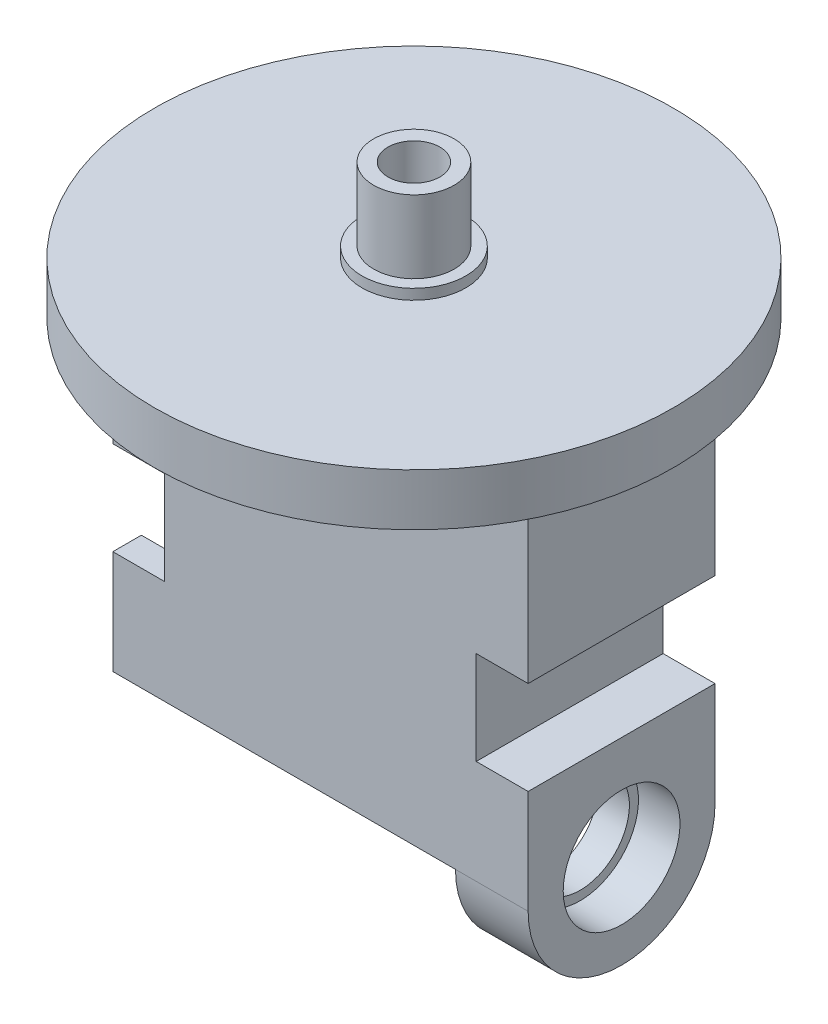
ISO-10303-21;
HEADER;
FILE_DESCRIPTION(('STEP AP214'),'2;1');
FILE_NAME('part.step','',(''),(''),'','','');
FILE_SCHEMA(('AUTOMOTIVE_DESIGN { 1 0 10303 214 1 1 1 1 }'));
ENDSEC;
DATA;
#1=APPLICATION_CONTEXT('core data for automotive mechanical design processes');
#2=APPLICATION_PROTOCOL_DEFINITION('international standard','automotive_design',2000,#1);
#3=PRODUCT_CONTEXT('',#1,'mechanical');
#4=PRODUCT('Part','Part','',(#3));
#5=PRODUCT_RELATED_PRODUCT_CATEGORY('part','',(#4));
#6=PRODUCT_DEFINITION_FORMATION('','',#4);
#7=PRODUCT_DEFINITION_CONTEXT('part definition',#1,'design');
#8=PRODUCT_DEFINITION('design','',#6,#7);
#9=PRODUCT_DEFINITION_SHAPE('','',#8);
#10=(LENGTH_UNIT() NAMED_UNIT(*) SI_UNIT(.MILLI.,.METRE.));
#11=(NAMED_UNIT(*) PLANE_ANGLE_UNIT() SI_UNIT($,.RADIAN.));
#12=(NAMED_UNIT(*) SI_UNIT($,.STERADIAN.) SOLID_ANGLE_UNIT());
#13=UNCERTAINTY_MEASURE_WITH_UNIT(LENGTH_MEASURE(1.E-05),#10,'distance_accuracy_value','');
#14=(GEOMETRIC_REPRESENTATION_CONTEXT(3) GLOBAL_UNCERTAINTY_ASSIGNED_CONTEXT((#13)) GLOBAL_UNIT_ASSIGNED_CONTEXT((#10,
#11,#12)) REPRESENTATION_CONTEXT('',''));
#15=CARTESIAN_POINT('',(0.,0.,0.));
#16=DIRECTION('',(0.,0.,1.));
#17=DIRECTION('',(1.,0.,0.));
#18=AXIS2_PLACEMENT_3D('',#15,#16,#17);
#19=CARTESIAN_POINT('',(13.,0.,-9.));
#20=DIRECTION('',(0.,0.,-1.));
#21=DIRECTION('',(0.,1.,0.));
#22=AXIS2_PLACEMENT_3D('',#19,#20,#21);
#23=PLANE('',#22);
#24=DIRECTION('',(0.,1.,0.));
#25=VECTOR('',#24,1.);
#26=CARTESIAN_POINT('',(20.,0.,-9.));
#27=LINE('',#26,#25);
#28=CARTESIAN_POINT('',(20.,-16.,-8.99999999999999));
#29=VERTEX_POINT('',#28);
#30=CARTESIAN_POINT('',(20.,0.,-9.));
#31=VERTEX_POINT('',#30);
#32=EDGE_CURVE('E372',#29,#31,#27,.T.);
#33=ORIENTED_EDGE('',*,*,#32,.F.);
#34=DIRECTION('',(1.,0.,0.));
#35=VECTOR('',#34,1.);
#36=CARTESIAN_POINT('',(15.,-16.,-8.99999999999999));
#37=LINE('',#36,#35);
#38=CARTESIAN_POINT('',(15.,-16.,-8.99999999999999));
#39=VERTEX_POINT('',#38);
#40=EDGE_CURVE('E221',#39,#29,#37,.T.);
#41=ORIENTED_EDGE('',*,*,#40,.F.);
#42=DIRECTION('',(0.,-1.,0.));
#43=VECTOR('',#42,1.);
#44=CARTESIAN_POINT('',(15.,-25.,-8.99999999999999));
#45=LINE('',#44,#43);
#46=CARTESIAN_POINT('',(15.,-25.,-8.99999999999999));
#47=VERTEX_POINT('',#46);
#48=EDGE_CURVE('E208',#39,#47,#45,.T.);
#49=ORIENTED_EDGE('',*,*,#48,.T.);
#50=DIRECTION('',(1.,0.,0.));
#51=VECTOR('',#50,1.);
#52=CARTESIAN_POINT('',(15.,-25.,-8.99999999999999));
#53=LINE('',#52,#51);
#54=CARTESIAN_POINT('',(20.,-25.,-8.99999999999999));
#55=VERTEX_POINT('',#54);
#56=EDGE_CURVE('E215',#47,#55,#53,.T.);
#57=ORIENTED_EDGE('',*,*,#56,.T.);
#58=CARTESIAN_POINT('',(20.,-35.,-8.99999999999999));
#59=VERTEX_POINT('',#58);
#60=EDGE_CURVE('E362',#59,#55,#27,.T.);
#61=ORIENTED_EDGE('',*,*,#60,.F.);
#62=DIRECTION('',(1.,0.,0.));
#63=VECTOR('',#62,1.);
#64=CARTESIAN_POINT('',(13.,-35.,-8.99999999999999));
#65=LINE('',#64,#63);
#66=CARTESIAN_POINT('',(13.,-35.,-8.99999999999999));
#67=VERTEX_POINT('',#66);
#68=EDGE_CURVE('E378',#67,#59,#65,.T.);
#69=ORIENTED_EDGE('',*,*,#68,.F.);
#70=DIRECTION('',(1.,0.,0.));
#71=VECTOR('',#70,1.);
#72=CARTESIAN_POINT('',(13.,-35.,-8.99999999999999));
#73=LINE('',#72,#71);
#74=CARTESIAN_POINT('',(-20.,-35.,-8.99999999999999));
#75=VERTEX_POINT('',#74);
#76=EDGE_CURVE('E333',#75,#67,#73,.T.);
#77=ORIENTED_EDGE('',*,*,#76,.F.);
#78=DIRECTION('',(0.,1.,0.));
#79=VECTOR('',#78,1.);
#80=CARTESIAN_POINT('',(-20.,-35.,-8.99999999999999));
#81=LINE('',#80,#79);
#82=CARTESIAN_POINT('',(-20.,-25.,-8.99999999999999));
#83=VERTEX_POINT('',#82);
#84=EDGE_CURVE('E339',#75,#83,#81,.T.);
#85=ORIENTED_EDGE('',*,*,#84,.T.);
#86=DIRECTION('',(-1.,0.,0.));
#87=VECTOR('',#86,1.);
#88=CARTESIAN_POINT('',(-15.,-25.,-8.99999999999999));
#89=LINE('',#88,#87);
#90=CARTESIAN_POINT('',(-15.,-25.,-8.99999999999999));
#91=VERTEX_POINT('',#90);
#92=EDGE_CURVE('E256',#91,#83,#89,.T.);
#93=ORIENTED_EDGE('',*,*,#92,.F.);
#94=DIRECTION('',(0.,-1.,0.));
#95=VECTOR('',#94,1.);
#96=CARTESIAN_POINT('',(-15.,-25.,-8.99999999999999));
#97=LINE('',#96,#95);
#98=CARTESIAN_POINT('',(-15.,-16.,-8.99999999999999));
#99=VERTEX_POINT('',#98);
#100=EDGE_CURVE('E247',#99,#91,#97,.T.);
#101=ORIENTED_EDGE('',*,*,#100,.F.);
#102=DIRECTION('',(-1.,0.,0.));
#103=VECTOR('',#102,1.);
#104=CARTESIAN_POINT('',(-15.,-16.,-8.99999999999999));
#105=LINE('',#104,#103);
#106=CARTESIAN_POINT('',(-20.,-16.,-8.99999999999999));
#107=VERTEX_POINT('',#106);
#108=EDGE_CURVE('E259',#99,#107,#105,.T.);
#109=ORIENTED_EDGE('',*,*,#108,.T.);
#110=CARTESIAN_POINT('',(-20.,0.,-8.99999999999999));
#111=VERTEX_POINT('',#110);
#112=EDGE_CURVE('E336',#107,#111,#81,.T.);
#113=ORIENTED_EDGE('',*,*,#112,.T.);
#114=DIRECTION('',(1.,0.,0.));
#115=VECTOR('',#114,1.);
#116=CARTESIAN_POINT('',(13.,0.,-9.));
#117=LINE('',#116,#115);
#118=EDGE_CURVE('E374',#111,#31,#117,.T.);
#119=ORIENTED_EDGE('',*,*,#118,.T.);
#120=EDGE_LOOP('',(#33,#41,#49,#57,#61,#69,#77,#85,#93,#101,#109,#113,#119));
#121=FACE_BOUND('',#120,.T.);
#122=ADVANCED_FACE('F41',(#121),#23,.T.);
#123=CARTESIAN_POINT('',(13.,0.,9.));
#124=DIRECTION('',(0.,0.,1.));
#125=DIRECTION('',(0.,-1.,0.));
#126=AXIS2_PLACEMENT_3D('',#123,#124,#125);
#127=PLANE('',#126);
#128=DIRECTION('',(0.,1.,0.));
#129=VECTOR('',#128,1.);
#130=CARTESIAN_POINT('',(15.,-25.,9.00000000000001));
#131=LINE('',#130,#129);
#132=CARTESIAN_POINT('',(15.,-25.,9.00000000000001));
#133=VERTEX_POINT('',#132);
#134=CARTESIAN_POINT('',(15.,-16.,9.00000000000001));
#135=VERTEX_POINT('',#134);
#136=EDGE_CURVE('E211',#133,#135,#131,.T.);
#137=ORIENTED_EDGE('',*,*,#136,.T.);
#138=DIRECTION('',(1.,0.,0.));
#139=VECTOR('',#138,1.);
#140=CARTESIAN_POINT('',(15.,-16.,9.00000000000001));
#141=LINE('',#140,#139);
#142=CARTESIAN_POINT('',(20.,-16.,9.00000000000001));
#143=VERTEX_POINT('',#142);
#144=EDGE_CURVE('E236',#135,#143,#141,.T.);
#145=ORIENTED_EDGE('',*,*,#144,.T.);
#146=DIRECTION('',(0.,-1.,0.));
#147=VECTOR('',#146,1.);
#148=CARTESIAN_POINT('',(20.,0.,9.));
#149=LINE('',#148,#147);
#150=CARTESIAN_POINT('',(20.,0.,9.));
#151=VERTEX_POINT('',#150);
#152=EDGE_CURVE('E366',#151,#143,#149,.T.);
#153=ORIENTED_EDGE('',*,*,#152,.F.);
#154=DIRECTION('',(1.,0.,0.));
#155=VECTOR('',#154,1.);
#156=CARTESIAN_POINT('',(13.,0.,9.));
#157=LINE('',#156,#155);
#158=CARTESIAN_POINT('',(-20.,0.,9.00000000000001));
#159=VERTEX_POINT('',#158);
#160=EDGE_CURVE('E361',#159,#151,#157,.T.);
#161=ORIENTED_EDGE('',*,*,#160,.F.);
#162=DIRECTION('',(0.,1.,0.));
#163=VECTOR('',#162,1.);
#164=CARTESIAN_POINT('',(-20.,-35.,9.00000000000001));
#165=LINE('',#164,#163);
#166=CARTESIAN_POINT('',(-20.,-16.,9.00000000000001));
#167=VERTEX_POINT('',#166);
#168=EDGE_CURVE('E342',#167,#159,#165,.T.);
#169=ORIENTED_EDGE('',*,*,#168,.F.);
#170=DIRECTION('',(-1.,0.,0.));
#171=VECTOR('',#170,1.);
#172=CARTESIAN_POINT('',(-15.,-16.,9.00000000000001));
#173=LINE('',#172,#171);
#174=CARTESIAN_POINT('',(-15.,-16.,9.00000000000001));
#175=VERTEX_POINT('',#174);
#176=EDGE_CURVE('E262',#175,#167,#173,.T.);
#177=ORIENTED_EDGE('',*,*,#176,.F.);
#178=DIRECTION('',(0.,1.,0.));
#179=VECTOR('',#178,1.);
#180=CARTESIAN_POINT('',(-15.,-25.,9.00000000000001));
#181=LINE('',#180,#179);
#182=CARTESIAN_POINT('',(-15.,-25.,9.00000000000001));
#183=VERTEX_POINT('',#182);
#184=EDGE_CURVE('E242',#183,#175,#181,.T.);
#185=ORIENTED_EDGE('',*,*,#184,.F.);
#186=DIRECTION('',(-1.,0.,0.));
#187=VECTOR('',#186,1.);
#188=CARTESIAN_POINT('',(-15.,-25.,9.00000000000001));
#189=LINE('',#188,#187);
#190=CARTESIAN_POINT('',(-20.,-25.,9.00000000000001));
#191=VERTEX_POINT('',#190);
#192=EDGE_CURVE('E250',#183,#191,#189,.T.);
#193=ORIENTED_EDGE('',*,*,#192,.T.);
#194=CARTESIAN_POINT('',(-20.,-35.,9.00000000000001));
#195=VERTEX_POINT('',#194);
#196=EDGE_CURVE('E343',#195,#191,#165,.T.);
#197=ORIENTED_EDGE('',*,*,#196,.F.);
#198=DIRECTION('',(-1.,0.,0.));
#199=VECTOR('',#198,1.);
#200=CARTESIAN_POINT('',(13.,-35.,9.00000000000001));
#201=LINE('',#200,#199);
#202=CARTESIAN_POINT('',(13.,-35.,9.00000000000001));
#203=VERTEX_POINT('',#202);
#204=EDGE_CURVE('E325',#203,#195,#201,.T.);
#205=ORIENTED_EDGE('',*,*,#204,.F.);
#206=DIRECTION('',(1.,0.,0.));
#207=VECTOR('',#206,1.);
#208=CARTESIAN_POINT('',(13.,-35.,9.00000000000001));
#209=LINE('',#208,#207);
#210=CARTESIAN_POINT('',(20.,-35.,9.00000000000001));
#211=VERTEX_POINT('',#210);
#212=EDGE_CURVE('E380',#203,#211,#209,.T.);
#213=ORIENTED_EDGE('',*,*,#212,.T.);
#214=CARTESIAN_POINT('',(20.,-25.,9.00000000000001));
#215=VERTEX_POINT('',#214);
#216=EDGE_CURVE('E365',#215,#211,#149,.T.);
#217=ORIENTED_EDGE('',*,*,#216,.F.);
#218=DIRECTION('',(1.,0.,0.));
#219=VECTOR('',#218,1.);
#220=CARTESIAN_POINT('',(15.,-25.,9.00000000000001));
#221=LINE('',#220,#219);
#222=EDGE_CURVE('E58',#133,#215,#221,.T.);
#223=ORIENTED_EDGE('',*,*,#222,.F.);
#224=EDGE_LOOP('',(#137,#145,#153,#161,#169,#177,#185,#193,#197,#205,#213,#217,#223));
#225=FACE_BOUND('',#224,.T.);
#226=ADVANCED_FACE('F545',(#225),#127,.T.);
#227=CARTESIAN_POINT('',(20.,-35.,0.));
#228=DIRECTION('',(1.,0.,0.));
#229=DIRECTION('',(0.,0.,-1.));
#230=AXIS2_PLACEMENT_3D('',#227,#228,#229);
#231=PLANE('',#230);
#232=ORIENTED_EDGE('',*,*,#152,.T.);
#233=DIRECTION('',(0.,0.,-1.));
#234=VECTOR('',#233,1.);
#235=CARTESIAN_POINT('',(20.,-16.,9.00000000000001));
#236=LINE('',#235,#234);
#237=EDGE_CURVE('E212',#143,#29,#236,.T.);
#238=ORIENTED_EDGE('',*,*,#237,.T.);
#239=ORIENTED_EDGE('',*,*,#32,.T.);
#240=DIRECTION('',(0.,0.,1.));
#241=VECTOR('',#240,1.);
#242=CARTESIAN_POINT('',(20.,0.,9.));
#243=LINE('',#242,#241);
#244=EDGE_CURVE('E356',#31,#151,#243,.T.);
#245=ORIENTED_EDGE('',*,*,#244,.T.);
#246=EDGE_LOOP('',(#232,#238,#239,#245));
#247=FACE_BOUND('',#246,.T.);
#248=ADVANCED_FACE('F541',(#247),#231,.T.);
#249=CARTESIAN_POINT('',(20.,-35.,0.));
#250=DIRECTION('',(-1.,0.,0.));
#251=DIRECTION('',(0.,0.,1.));
#252=AXIS2_PLACEMENT_3D('',#249,#250,#251);
#253=CIRCLE('',#252,5.625);
#254=CARTESIAN_POINT('',(20.,-35.,5.62500000000001));
#255=VERTEX_POINT('',#254);
#256=EDGE_CURVE('E346',#255,#255,#253,.T.);
#257=ORIENTED_EDGE('',*,*,#256,.T.);
#258=EDGE_LOOP('',(#257));
#259=FACE_BOUND('',#258,.T.);
#260=ORIENTED_EDGE('',*,*,#60,.T.);
#261=DIRECTION('',(0.,0.,1.));
#262=VECTOR('',#261,1.);
#263=CARTESIAN_POINT('',(20.,-25.,-6.25));
#264=LINE('',#263,#262);
#265=EDGE_CURVE('E217',#55,#215,#264,.T.);
#266=ORIENTED_EDGE('',*,*,#265,.T.);
#267=ORIENTED_EDGE('',*,*,#216,.T.);
#268=CARTESIAN_POINT('',(20.,-35.,0.));
#269=DIRECTION('',(1.,0.,0.));
#270=DIRECTION('',(0.,0.,-1.));
#271=AXIS2_PLACEMENT_3D('',#268,#269,#270);
#272=CIRCLE('',#271,9.);
#273=EDGE_CURVE('E369',#211,#59,#272,.T.);
#274=ORIENTED_EDGE('',*,*,#273,.T.);
#275=EDGE_LOOP('',(#260,#266,#267,#274));
#276=FACE_BOUND('',#275,.T.);
#277=ADVANCED_FACE('F544',(#259,#276),#231,.T.);
#278=CARTESIAN_POINT('',(-20.,-35.,9.00000000000001));
#279=DIRECTION('',(1.,0.,0.));
#280=DIRECTION('',(0.,0.,-1.));
#281=AXIS2_PLACEMENT_3D('',#278,#279,#280);
#282=PLANE('',#281);
#283=DIRECTION('',(0.,-1.,0.));
#284=VECTOR('',#283,1.);
#285=CARTESIAN_POINT('',(-20.,-35.,-6.25));
#286=LINE('',#285,#284);
#287=CARTESIAN_POINT('',(-20.,-25.,-6.25));
#288=VERTEX_POINT('',#287);
#289=CARTESIAN_POINT('',(-20.,-35.,-6.25));
#290=VERTEX_POINT('',#289);
#291=EDGE_CURVE('E308',#288,#290,#286,.T.);
#292=ORIENTED_EDGE('',*,*,#291,.F.);
#293=DIRECTION('',(0.,0.,1.));
#294=VECTOR('',#293,1.);
#295=CARTESIAN_POINT('',(-20.,-25.,-6.25));
#296=LINE('',#295,#294);
#297=EDGE_CURVE('E254',#83,#288,#296,.T.);
#298=ORIENTED_EDGE('',*,*,#297,.F.);
#299=ORIENTED_EDGE('',*,*,#84,.F.);
#300=DIRECTION('',(0.,0.,-1.));
#301=VECTOR('',#300,1.);
#302=CARTESIAN_POINT('',(-20.,-35.,9.00000000000001));
#303=LINE('',#302,#301);
#304=EDGE_CURVE('E329',#290,#75,#303,.T.);
#305=ORIENTED_EDGE('',*,*,#304,.F.);
#306=EDGE_LOOP('',(#292,#298,#299,#305));
#307=FACE_BOUND('',#306,.T.);
#308=ADVANCED_FACE('F520',(#307),#282,.F.);
#309=ORIENTED_EDGE('',*,*,#196,.T.);
#310=CARTESIAN_POINT('',(-20.,-25.,6.25));
#311=VERTEX_POINT('',#310);
#312=EDGE_CURVE('E253',#311,#191,#296,.T.);
#313=ORIENTED_EDGE('',*,*,#312,.F.);
#314=DIRECTION('',(0.,1.,0.));
#315=VECTOR('',#314,1.);
#316=CARTESIAN_POINT('',(-20.,-35.,6.25));
#317=LINE('',#316,#315);
#318=CARTESIAN_POINT('',(-20.,-35.,6.25));
#319=VERTEX_POINT('',#318);
#320=EDGE_CURVE('E305',#319,#311,#317,.T.);
#321=ORIENTED_EDGE('',*,*,#320,.F.);
#322=EDGE_CURVE('E330',#195,#319,#303,.T.);
#323=ORIENTED_EDGE('',*,*,#322,.F.);
#324=EDGE_LOOP('',(#309,#313,#321,#323));
#325=FACE_BOUND('',#324,.T.);
#326=ADVANCED_FACE('F506',(#325),#282,.F.);
#327=CARTESIAN_POINT('',(8.,-17.,6.25));
#328=DIRECTION('',(0.,1.,0.));
#329=DIRECTION('',(0.,0.,1.));
#330=AXIS2_PLACEMENT_3D('',#327,#328,#329);
#331=PLANE('',#330);
#332=DIRECTION('',(0.,0.,-1.));
#333=VECTOR('',#332,1.);
#334=CARTESIAN_POINT('',(-9.21,-17.,6.25));
#335=LINE('',#334,#333);
#336=CARTESIAN_POINT('',(-9.21,-17.,6.25));
#337=VERTEX_POINT('',#336);
#338=CARTESIAN_POINT('',(-9.21,-17.,-6.25));
#339=VERTEX_POINT('',#338);
#340=EDGE_CURVE('E276',#337,#339,#335,.T.);
#341=ORIENTED_EDGE('',*,*,#340,.T.);
#342=DIRECTION('',(-1.,0.,0.));
#343=VECTOR('',#342,1.);
#344=CARTESIAN_POINT('',(8.,-17.,-6.25));
#345=LINE('',#344,#343);
#346=CARTESIAN_POINT('',(8.,-17.,-6.25));
#347=VERTEX_POINT('',#346);
#348=EDGE_CURVE('E317',#347,#339,#345,.T.);
#349=ORIENTED_EDGE('',*,*,#348,.F.);
#350=DIRECTION('',(0.,0.,-1.));
#351=VECTOR('',#350,1.);
#352=CARTESIAN_POINT('',(8.,-17.,6.25));
#353=LINE('',#352,#351);
#354=CARTESIAN_POINT('',(8.,-17.,6.25));
#355=VERTEX_POINT('',#354);
#356=EDGE_CURVE('E295',#355,#347,#353,.T.);
#357=ORIENTED_EDGE('',*,*,#356,.F.);
#358=DIRECTION('',(-1.,0.,0.));
#359=VECTOR('',#358,1.);
#360=CARTESIAN_POINT('',(8.,-17.,6.25));
#361=LINE('',#360,#359);
#362=EDGE_CURVE('E304',#355,#337,#361,.T.);
#363=ORIENTED_EDGE('',*,*,#362,.T.);
#364=EDGE_LOOP('',(#341,#349,#357,#363));
#365=FACE_BOUND('',#364,.T.);
#366=ADVANCED_FACE('F502',(#365),#331,.F.);
#367=CARTESIAN_POINT('',(0.,0.,0.));
#368=DIRECTION('',(0.,1.,0.));
#369=DIRECTION('',(0.,0.,1.));
#370=AXIS2_PLACEMENT_3D('',#367,#368,#369);
#371=PLANE('',#370);
#372=CARTESIAN_POINT('',(0.,0.,0.));
#373=DIRECTION('',(0.,1.,0.));
#374=DIRECTION('',(0.,0.,1.));
#375=AXIS2_PLACEMENT_3D('',#372,#373,#374);
#376=CIRCLE('',#375,25.);
#377=CARTESIAN_POINT('',(0.,0.,25.));
#378=VERTEX_POINT('',#377);
#379=EDGE_CURVE('E377',#378,#378,#376,.T.);
#380=ORIENTED_EDGE('',*,*,#379,.F.);
#381=EDGE_LOOP('',(#380));
#382=FACE_BOUND('',#381,.T.);
#383=DIRECTION('',(0.,0.,-1.));
#384=VECTOR('',#383,1.);
#385=CARTESIAN_POINT('',(-20.,0.,9.00000000000001));
#386=LINE('',#385,#384);
#387=EDGE_CURVE('E313',#159,#111,#386,.T.);
#388=ORIENTED_EDGE('',*,*,#387,.F.);
#389=ORIENTED_EDGE('',*,*,#160,.T.);
#390=ORIENTED_EDGE('',*,*,#244,.F.);
#391=ORIENTED_EDGE('',*,*,#118,.F.);
#392=EDGE_LOOP('',(#388,#389,#390,#391));
#393=FACE_BOUND('',#392,.T.);
#394=ADVANCED_FACE('F505',(#382,#393),#371,.F.);
#395=CARTESIAN_POINT('',(13.,-35.,0.));
#396=DIRECTION('',(1.,0.,0.));
#397=DIRECTION('',(0.,0.,-1.));
#398=AXIS2_PLACEMENT_3D('',#395,#396,#397);
#399=PLANE('',#398);
#400=DIRECTION('',(0.,0.,1.));
#401=VECTOR('',#400,1.);
#402=CARTESIAN_POINT('',(13.,-35.,9.00000000000001));
#403=LINE('',#402,#401);
#404=CARTESIAN_POINT('',(13.,-35.,-4.75));
#405=VERTEX_POINT('',#404);
#406=EDGE_CURVE('E322',#67,#405,#403,.T.);
#407=ORIENTED_EDGE('',*,*,#406,.F.);
#408=CARTESIAN_POINT('',(13.,-35.,0.));
#409=DIRECTION('',(1.,0.,0.));
#410=DIRECTION('',(0.,0.,-1.));
#411=AXIS2_PLACEMENT_3D('',#408,#409,#410);
#412=CIRCLE('',#411,9.);
#413=EDGE_CURVE('E358',#203,#67,#412,.T.);
#414=ORIENTED_EDGE('',*,*,#413,.F.);
#415=CARTESIAN_POINT('',(13.,-35.,4.75000000000001));
#416=VERTEX_POINT('',#415);
#417=EDGE_CURVE('E327',#416,#203,#403,.T.);
#418=ORIENTED_EDGE('',*,*,#417,.F.);
#419=CARTESIAN_POINT('',(13.,-35.,0.));
#420=DIRECTION('',(1.,0.,0.));
#421=DIRECTION('',(0.,0.,-1.));
#422=AXIS2_PLACEMENT_3D('',#419,#420,#421);
#423=CIRCLE('',#422,4.75000000000001);
#424=EDGE_CURVE('E357',#416,#405,#423,.T.);
#425=ORIENTED_EDGE('',*,*,#424,.T.);
#426=EDGE_LOOP('',(#407,#414,#418,#425));
#427=FACE_BOUND('',#426,.T.);
#428=ADVANCED_FACE('F537',(#427),#399,.F.);
#429=CARTESIAN_POINT('',(0.,5.,0.));
#430=DIRECTION('',(0.,-1.,0.));
#431=DIRECTION('',(0.,0.,-1.));
#432=AXIS2_PLACEMENT_3D('',#429,#430,#431);
#433=CYLINDRICAL_SURFACE('',#432,25.);
#434=CARTESIAN_POINT('',(0.,5.,0.));
#435=DIRECTION('',(0.,1.,0.));
#436=DIRECTION('',(0.,0.,1.));
#437=AXIS2_PLACEMENT_3D('',#434,#435,#436);
#438=CIRCLE('',#437,25.);
#439=CARTESIAN_POINT('',(0.,5.,25.));
#440=VERTEX_POINT('',#439);
#441=EDGE_CURVE('E385',#440,#440,#438,.T.);
#442=ORIENTED_EDGE('',*,*,#441,.F.);
#443=EDGE_LOOP('',(#442));
#444=FACE_BOUND('',#443,.T.);
#445=ORIENTED_EDGE('',*,*,#379,.T.);
#446=EDGE_LOOP('',(#445));
#447=FACE_BOUND('',#446,.T.);
#448=ADVANCED_FACE('F43',(#444,#447),#433,.T.);
#449=CARTESIAN_POINT('',(0.,5.,0.));
#450=DIRECTION('',(0.,1.,0.));
#451=DIRECTION('',(0.,0.,1.));
#452=AXIS2_PLACEMENT_3D('',#449,#450,#451);
#453=PLANE('',#452);
#454=CARTESIAN_POINT('',(0.,5.,0.));
#455=DIRECTION('',(0.,1.,0.));
#456=DIRECTION('',(0.,0.,1.));
#457=AXIS2_PLACEMENT_3D('',#454,#455,#456);
#458=CIRCLE('',#457,5.);
#459=CARTESIAN_POINT('',(0.,5.,5.));
#460=VERTEX_POINT('',#459);
#461=EDGE_CURVE('E50',#460,#460,#458,.T.);
#462=ORIENTED_EDGE('',*,*,#461,.F.);
#463=EDGE_LOOP('',(#462));
#464=FACE_BOUND('',#463,.T.);
#465=ORIENTED_EDGE('',*,*,#441,.T.);
#466=EDGE_LOOP('',(#465));
#467=FACE_BOUND('',#466,.T.);
#468=ADVANCED_FACE('F551',(#464,#467),#453,.T.);
#469=CARTESIAN_POINT('',(13.,-35.,0.));
#470=DIRECTION('',(1.,0.,0.));
#471=DIRECTION('',(0.,0.,-1.));
#472=AXIS2_PLACEMENT_3D('',#469,#470,#471);
#473=CYLINDRICAL_SURFACE('',#472,9.);
#474=ORIENTED_EDGE('',*,*,#273,.F.);
#475=ORIENTED_EDGE('',*,*,#212,.F.);
#476=ORIENTED_EDGE('',*,*,#413,.T.);
#477=ORIENTED_EDGE('',*,*,#68,.T.);
#478=EDGE_LOOP('',(#474,#475,#476,#477));
#479=FACE_BOUND('',#478,.T.);
#480=ADVANCED_FACE('F535',(#479),#473,.T.);
#481=CARTESIAN_POINT('',(13.,-35.,0.));
#482=DIRECTION('',(1.,0.,0.));
#483=DIRECTION('',(0.,0.,-1.));
#484=AXIS2_PLACEMENT_3D('',#481,#482,#483);
#485=CYLINDRICAL_SURFACE('',#484,4.75000000000001);
#486=CARTESIAN_POINT('',(16.,-35.,0.));
#487=DIRECTION('',(-1.,0.,0.));
#488=DIRECTION('',(0.,0.,1.));
#489=AXIS2_PLACEMENT_3D('',#486,#487,#488);
#490=CIRCLE('',#489,4.75000000000001);
#491=CARTESIAN_POINT('',(16.,-35.,4.75000000000001));
#492=VERTEX_POINT('',#491);
#493=EDGE_CURVE('E350',#492,#492,#490,.F.);
#494=ORIENTED_EDGE('',*,*,#493,.T.);
#495=EDGE_LOOP('',(#494));
#496=FACE_BOUND('',#495,.T.);
#497=EDGE_CURVE('E353',#405,#416,#423,.T.);
#498=ORIENTED_EDGE('',*,*,#497,.F.);
#499=ORIENTED_EDGE('',*,*,#424,.F.);
#500=EDGE_LOOP('',(#498,#499));
#501=FACE_BOUND('',#500,.T.);
#502=ADVANCED_FACE('F528',(#496,#501),#485,.F.);
#503=CARTESIAN_POINT('',(16.,-35.,0.));
#504=DIRECTION('',(-1.,0.,0.));
#505=DIRECTION('',(0.,0.,1.));
#506=AXIS2_PLACEMENT_3D('',#503,#504,#505);
#507=PLANE('',#506);
#508=CARTESIAN_POINT('',(16.,-35.,0.));
#509=DIRECTION('',(-1.,0.,0.));
#510=DIRECTION('',(0.,0.,1.));
#511=AXIS2_PLACEMENT_3D('',#508,#509,#510);
#512=CIRCLE('',#511,5.625);
#513=CARTESIAN_POINT('',(16.,-35.,5.62500000000001));
#514=VERTEX_POINT('',#513);
#515=EDGE_CURVE('E347',#514,#514,#512,.T.);
#516=ORIENTED_EDGE('',*,*,#515,.F.);
#517=EDGE_LOOP('',(#516));
#518=FACE_BOUND('',#517,.T.);
#519=ORIENTED_EDGE('',*,*,#493,.F.);
#520=EDGE_LOOP('',(#519));
#521=FACE_BOUND('',#520,.T.);
#522=ADVANCED_FACE('F525',(#518,#521),#507,.F.);
#523=CARTESIAN_POINT('',(16.,-35.,0.));
#524=DIRECTION('',(1.,0.,0.));
#525=DIRECTION('',(0.,0.,-1.));
#526=AXIS2_PLACEMENT_3D('',#523,#524,#525);
#527=CYLINDRICAL_SURFACE('',#526,5.625);
#528=ORIENTED_EDGE('',*,*,#515,.T.);
#529=EDGE_LOOP('',(#528));
#530=FACE_BOUND('',#529,.T.);
#531=ORIENTED_EDGE('',*,*,#256,.F.);
#532=EDGE_LOOP('',(#531));
#533=FACE_BOUND('',#532,.T.);
#534=ADVANCED_FACE('F523',(#530,#533),#527,.F.);
#535=CARTESIAN_POINT('',(13.,-35.,9.00000000000001));
#536=DIRECTION('',(-1.,0.,0.));
#537=DIRECTION('',(0.,0.,1.));
#538=AXIS2_PLACEMENT_3D('',#535,#536,#537);
#539=PLANE('',#538);
#540=EDGE_CURVE('E326',#405,#416,#403,.T.);
#541=ORIENTED_EDGE('',*,*,#540,.F.);
#542=ORIENTED_EDGE('',*,*,#497,.T.);
#543=EDGE_LOOP('',(#541,#542));
#544=FACE_BOUND('',#543,.T.);
#545=ADVANCED_FACE('F518',(#544),#539,.F.);
#546=ORIENTED_EDGE('',*,*,#112,.F.);
#547=DIRECTION('',(0.,0.,-1.));
#548=VECTOR('',#547,1.);
#549=CARTESIAN_POINT('',(-20.,-16.,-6.25));
#550=LINE('',#549,#548);
#551=CARTESIAN_POINT('',(-20.,-16.,-6.25));
#552=VERTEX_POINT('',#551);
#553=EDGE_CURVE('E235',#552,#107,#550,.T.);
#554=ORIENTED_EDGE('',*,*,#553,.F.);
#555=CARTESIAN_POINT('',(-20.,-11.,-6.25));
#556=VERTEX_POINT('',#555);
#557=EDGE_CURVE('E296',#556,#552,#286,.T.);
#558=ORIENTED_EDGE('',*,*,#557,.F.);
#559=DIRECTION('',(0.,0.,-1.));
#560=VECTOR('',#559,1.);
#561=CARTESIAN_POINT('',(-20.,-11.,6.25));
#562=LINE('',#561,#560);
#563=CARTESIAN_POINT('',(-20.,-11.,6.25));
#564=VERTEX_POINT('',#563);
#565=EDGE_CURVE('E273',#564,#556,#562,.T.);
#566=ORIENTED_EDGE('',*,*,#565,.F.);
#567=CARTESIAN_POINT('',(-20.,-16.,6.25));
#568=VERTEX_POINT('',#567);
#569=EDGE_CURVE('E291',#568,#564,#317,.T.);
#570=ORIENTED_EDGE('',*,*,#569,.F.);
#571=EDGE_CURVE('E251',#167,#568,#550,.T.);
#572=ORIENTED_EDGE('',*,*,#571,.F.);
#573=ORIENTED_EDGE('',*,*,#168,.T.);
#574=ORIENTED_EDGE('',*,*,#387,.T.);
#575=EDGE_LOOP('',(#546,#554,#558,#566,#570,#572,#573,#574));
#576=FACE_BOUND('',#575,.T.);
#577=ADVANCED_FACE('F514',(#576),#282,.F.);
#578=CARTESIAN_POINT('',(0.,-35.,0.));
#579=DIRECTION('',(0.,1.,0.));
#580=DIRECTION('',(0.,0.,1.));
#581=AXIS2_PLACEMENT_3D('',#578,#579,#580);
#582=PLANE('',#581);
#583=ORIENTED_EDGE('',*,*,#322,.T.);
#584=DIRECTION('',(-1.,0.,0.));
#585=VECTOR('',#584,1.);
#586=CARTESIAN_POINT('',(8.,-35.,6.25));
#587=LINE('',#586,#585);
#588=CARTESIAN_POINT('',(8.,-35.,6.25));
#589=VERTEX_POINT('',#588);
#590=EDGE_CURVE('E311',#589,#319,#587,.T.);
#591=ORIENTED_EDGE('',*,*,#590,.F.);
#592=DIRECTION('',(0.,0.,1.));
#593=VECTOR('',#592,1.);
#594=CARTESIAN_POINT('',(8.,-35.,6.25));
#595=LINE('',#594,#593);
#596=CARTESIAN_POINT('',(8.,-35.,-6.25));
#597=VERTEX_POINT('',#596);
#598=EDGE_CURVE('E301',#597,#589,#595,.T.);
#599=ORIENTED_EDGE('',*,*,#598,.F.);
#600=DIRECTION('',(-1.,0.,0.));
#601=VECTOR('',#600,1.);
#602=CARTESIAN_POINT('',(8.,-35.,-6.25));
#603=LINE('',#602,#601);
#604=EDGE_CURVE('E314',#597,#290,#603,.T.);
#605=ORIENTED_EDGE('',*,*,#604,.T.);
#606=ORIENTED_EDGE('',*,*,#304,.T.);
#607=ORIENTED_EDGE('',*,*,#76,.T.);
#608=ORIENTED_EDGE('',*,*,#406,.T.);
#609=ORIENTED_EDGE('',*,*,#540,.T.);
#610=ORIENTED_EDGE('',*,*,#417,.T.);
#611=ORIENTED_EDGE('',*,*,#204,.T.);
#612=EDGE_LOOP('',(#583,#591,#599,#605,#606,#607,#608,#609,#610,#611));
#613=FACE_BOUND('',#612,.T.);
#614=ADVANCED_FACE('F510',(#613),#582,.F.);
#615=CARTESIAN_POINT('',(8.,-35.,6.25));
#616=DIRECTION('',(0.,0.,1.));
#617=DIRECTION('',(1.,0.,0.));
#618=AXIS2_PLACEMENT_3D('',#615,#616,#617);
#619=PLANE('',#618);
#620=ORIENTED_EDGE('',*,*,#320,.T.);
#621=DIRECTION('',(1.,0.,0.));
#622=VECTOR('',#621,1.);
#623=CARTESIAN_POINT('',(8.,-25.,6.25));
#624=LINE('',#623,#622);
#625=CARTESIAN_POINT('',(-15.,-25.,6.25));
#626=VERTEX_POINT('',#625);
#627=EDGE_CURVE('E270',#311,#626,#624,.T.);
#628=ORIENTED_EDGE('',*,*,#627,.T.);
#629=DIRECTION('',(0.,-1.,0.));
#630=VECTOR('',#629,1.);
#631=CARTESIAN_POINT('',(-15.,-35.,6.25));
#632=LINE('',#631,#630);
#633=CARTESIAN_POINT('',(-15.,-16.,6.25));
#634=VERTEX_POINT('',#633);
#635=EDGE_CURVE('E258',#634,#626,#632,.T.);
#636=ORIENTED_EDGE('',*,*,#635,.F.);
#637=DIRECTION('',(-1.,0.,0.));
#638=VECTOR('',#637,1.);
#639=CARTESIAN_POINT('',(8.,-16.,6.25));
#640=LINE('',#639,#638);
#641=EDGE_CURVE('E267',#634,#568,#640,.T.);
#642=ORIENTED_EDGE('',*,*,#641,.T.);
#643=ORIENTED_EDGE('',*,*,#569,.T.);
#644=DIRECTION('',(-1.,0.,0.));
#645=VECTOR('',#644,1.);
#646=CARTESIAN_POINT('',(21.865424623862,-11.,6.25));
#647=LINE('',#646,#645);
#648=CARTESIAN_POINT('',(-9.21,-11.,6.25));
#649=VERTEX_POINT('',#648);
#650=EDGE_CURVE('E285',#649,#564,#647,.T.);
#651=ORIENTED_EDGE('',*,*,#650,.F.);
#652=DIRECTION('',(0.,-1.,0.));
#653=VECTOR('',#652,1.);
#654=CARTESIAN_POINT('',(-9.21,-17.,6.25));
#655=LINE('',#654,#653);
#656=EDGE_CURVE('E280',#649,#337,#655,.T.);
#657=ORIENTED_EDGE('',*,*,#656,.T.);
#658=ORIENTED_EDGE('',*,*,#362,.F.);
#659=DIRECTION('',(0.,1.,0.));
#660=VECTOR('',#659,1.);
#661=CARTESIAN_POINT('',(8.,-35.,6.25));
#662=LINE('',#661,#660);
#663=EDGE_CURVE('E292',#589,#355,#662,.T.);
#664=ORIENTED_EDGE('',*,*,#663,.F.);
#665=ORIENTED_EDGE('',*,*,#590,.T.);
#666=EDGE_LOOP('',(#620,#628,#636,#642,#643,#651,#657,#658,#664,#665));
#667=FACE_BOUND('',#666,.T.);
#668=ADVANCED_FACE('F501',(#667),#619,.F.);
#669=CARTESIAN_POINT('',(8.,-35.,-6.25));
#670=DIRECTION('',(0.,0.,-1.));
#671=DIRECTION('',(-1.,0.,0.));
#672=AXIS2_PLACEMENT_3D('',#669,#670,#671);
#673=PLANE('',#672);
#674=DIRECTION('',(0.,1.,0.));
#675=VECTOR('',#674,1.);
#676=CARTESIAN_POINT('',(-15.,-35.,-6.25));
#677=LINE('',#676,#675);
#678=CARTESIAN_POINT('',(-15.,-25.,-6.25));
#679=VERTEX_POINT('',#678);
#680=CARTESIAN_POINT('',(-15.,-16.,-6.25));
#681=VERTEX_POINT('',#680);
#682=EDGE_CURVE('E388',#679,#681,#677,.T.);
#683=ORIENTED_EDGE('',*,*,#682,.F.);
#684=DIRECTION('',(-1.,0.,0.));
#685=VECTOR('',#684,1.);
#686=CARTESIAN_POINT('',(8.,-25.,-6.25));
#687=LINE('',#686,#685);
#688=EDGE_CURVE('E45',#679,#288,#687,.T.);
#689=ORIENTED_EDGE('',*,*,#688,.T.);
#690=ORIENTED_EDGE('',*,*,#291,.T.);
#691=ORIENTED_EDGE('',*,*,#604,.F.);
#692=DIRECTION('',(0.,-1.,0.));
#693=VECTOR('',#692,1.);
#694=CARTESIAN_POINT('',(8.,-35.,-6.25));
#695=LINE('',#694,#693);
#696=EDGE_CURVE('E299',#347,#597,#695,.T.);
#697=ORIENTED_EDGE('',*,*,#696,.F.);
#698=ORIENTED_EDGE('',*,*,#348,.T.);
#699=DIRECTION('',(0.,1.,0.));
#700=VECTOR('',#699,1.);
#701=CARTESIAN_POINT('',(-9.21,-17.,-6.25));
#702=LINE('',#701,#700);
#703=CARTESIAN_POINT('',(-9.21,-11.,-6.25));
#704=VERTEX_POINT('',#703);
#705=EDGE_CURVE('E274',#339,#704,#702,.T.);
#706=ORIENTED_EDGE('',*,*,#705,.T.);
#707=DIRECTION('',(-1.,0.,0.));
#708=VECTOR('',#707,1.);
#709=CARTESIAN_POINT('',(21.865424623862,-11.,-6.25));
#710=LINE('',#709,#708);
#711=EDGE_CURVE('E277',#704,#556,#710,.T.);
#712=ORIENTED_EDGE('',*,*,#711,.T.);
#713=ORIENTED_EDGE('',*,*,#557,.T.);
#714=DIRECTION('',(1.,0.,0.));
#715=VECTOR('',#714,1.);
#716=CARTESIAN_POINT('',(8.,-16.,-6.25));
#717=LINE('',#716,#715);
#718=EDGE_CURVE('E393',#552,#681,#717,.T.);
#719=ORIENTED_EDGE('',*,*,#718,.T.);
#720=EDGE_LOOP('',(#683,#689,#690,#691,#697,#698,#706,#712,#713,#719));
#721=FACE_BOUND('',#720,.T.);
#722=ADVANCED_FACE('F497',(#721),#673,.F.);
#723=CARTESIAN_POINT('',(8.,0.,0.));
#724=DIRECTION('',(-1.,0.,0.));
#725=DIRECTION('',(0.,0.,1.));
#726=AXIS2_PLACEMENT_3D('',#723,#724,#725);
#727=PLANE('',#726);
#728=ORIENTED_EDGE('',*,*,#663,.T.);
#729=ORIENTED_EDGE('',*,*,#356,.T.);
#730=ORIENTED_EDGE('',*,*,#696,.T.);
#731=ORIENTED_EDGE('',*,*,#598,.T.);
#732=EDGE_LOOP('',(#728,#729,#730,#731));
#733=FACE_BOUND('',#732,.T.);
#734=ADVANCED_FACE('F493',(#733),#727,.T.);
#735=CARTESIAN_POINT('',(21.865424623862,-11.,6.25));
#736=DIRECTION('',(0.,1.,0.));
#737=DIRECTION('',(0.,0.,1.));
#738=AXIS2_PLACEMENT_3D('',#735,#736,#737);
#739=PLANE('',#738);
#740=DIRECTION('',(0.,0.,1.));
#741=VECTOR('',#740,1.);
#742=CARTESIAN_POINT('',(-9.21,-11.,6.25));
#743=LINE('',#742,#741);
#744=EDGE_CURVE('E282',#704,#649,#743,.T.);
#745=ORIENTED_EDGE('',*,*,#744,.T.);
#746=ORIENTED_EDGE('',*,*,#650,.T.);
#747=ORIENTED_EDGE('',*,*,#565,.T.);
#748=ORIENTED_EDGE('',*,*,#711,.F.);
#749=EDGE_LOOP('',(#745,#746,#747,#748));
#750=FACE_BOUND('',#749,.T.);
#751=ADVANCED_FACE('F489',(#750),#739,.F.);
#752=CARTESIAN_POINT('',(-9.21,0.,0.));
#753=DIRECTION('',(-1.,0.,0.));
#754=DIRECTION('',(0.,0.,1.));
#755=AXIS2_PLACEMENT_3D('',#752,#753,#754);
#756=PLANE('',#755);
#757=ORIENTED_EDGE('',*,*,#656,.F.);
#758=ORIENTED_EDGE('',*,*,#744,.F.);
#759=ORIENTED_EDGE('',*,*,#705,.F.);
#760=ORIENTED_EDGE('',*,*,#340,.F.);
#761=EDGE_LOOP('',(#757,#758,#759,#760));
#762=FACE_BOUND('',#761,.T.);
#763=ADVANCED_FACE('F486',(#762),#756,.T.);
#764=CARTESIAN_POINT('',(-15.,0.,0.));
#765=DIRECTION('',(-1.,0.,0.));
#766=DIRECTION('',(0.,0.,1.));
#767=AXIS2_PLACEMENT_3D('',#764,#765,#766);
#768=PLANE('',#767);
#769=ORIENTED_EDGE('',*,*,#682,.T.);
#770=DIRECTION('',(0.,0.,-1.));
#771=VECTOR('',#770,1.);
#772=CARTESIAN_POINT('',(-15.,-16.,9.00000000000001));
#773=LINE('',#772,#771);
#774=EDGE_CURVE('E245',#681,#99,#773,.T.);
#775=ORIENTED_EDGE('',*,*,#774,.T.);
#776=ORIENTED_EDGE('',*,*,#100,.T.);
#777=DIRECTION('',(0.,0.,1.));
#778=VECTOR('',#777,1.);
#779=CARTESIAN_POINT('',(-15.,-25.,-6.25));
#780=LINE('',#779,#778);
#781=EDGE_CURVE('E240',#91,#679,#780,.T.);
#782=ORIENTED_EDGE('',*,*,#781,.T.);
#783=EDGE_LOOP('',(#769,#775,#776,#782));
#784=FACE_BOUND('',#783,.T.);
#785=ADVANCED_FACE('F476',(#784),#768,.T.);
#786=CARTESIAN_POINT('',(-15.,-16.,-6.25));
#787=DIRECTION('',(0.,1.,0.));
#788=DIRECTION('',(0.,0.,1.));
#789=AXIS2_PLACEMENT_3D('',#786,#787,#788);
#790=PLANE('',#789);
#791=ORIENTED_EDGE('',*,*,#553,.T.);
#792=ORIENTED_EDGE('',*,*,#108,.F.);
#793=ORIENTED_EDGE('',*,*,#774,.F.);
#794=ORIENTED_EDGE('',*,*,#718,.F.);
#795=EDGE_LOOP('',(#791,#792,#793,#794));
#796=FACE_BOUND('',#795,.T.);
#797=ADVANCED_FACE('F485',(#796),#790,.F.);
#798=CARTESIAN_POINT('',(-15.,-25.,-6.25));
#799=DIRECTION('',(0.,-1.,0.));
#800=DIRECTION('',(0.,0.,-1.));
#801=AXIS2_PLACEMENT_3D('',#798,#799,#800);
#802=PLANE('',#801);
#803=ORIENTED_EDGE('',*,*,#781,.F.);
#804=ORIENTED_EDGE('',*,*,#92,.T.);
#805=ORIENTED_EDGE('',*,*,#297,.T.);
#806=ORIENTED_EDGE('',*,*,#688,.F.);
#807=EDGE_LOOP('',(#803,#804,#805,#806));
#808=FACE_BOUND('',#807,.T.);
#809=ADVANCED_FACE('F480',(#808),#802,.F.);
#810=ORIENTED_EDGE('',*,*,#312,.T.);
#811=ORIENTED_EDGE('',*,*,#192,.F.);
#812=EDGE_CURVE('E243',#626,#183,#780,.T.);
#813=ORIENTED_EDGE('',*,*,#812,.F.);
#814=ORIENTED_EDGE('',*,*,#627,.F.);
#815=EDGE_LOOP('',(#810,#811,#813,#814));
#816=FACE_BOUND('',#815,.T.);
#817=ADVANCED_FACE('F477',(#816),#802,.F.);
#818=EDGE_CURVE('E66',#175,#634,#773,.T.);
#819=ORIENTED_EDGE('',*,*,#818,.F.);
#820=ORIENTED_EDGE('',*,*,#176,.T.);
#821=ORIENTED_EDGE('',*,*,#571,.T.);
#822=ORIENTED_EDGE('',*,*,#641,.F.);
#823=EDGE_LOOP('',(#819,#820,#821,#822));
#824=FACE_BOUND('',#823,.T.);
#825=ADVANCED_FACE('F475',(#824),#790,.F.);
#826=ORIENTED_EDGE('',*,*,#635,.T.);
#827=ORIENTED_EDGE('',*,*,#812,.T.);
#828=ORIENTED_EDGE('',*,*,#184,.T.);
#829=ORIENTED_EDGE('',*,*,#818,.T.);
#830=EDGE_LOOP('',(#826,#827,#828,#829));
#831=FACE_BOUND('',#830,.T.);
#832=ADVANCED_FACE('F469',(#831),#768,.T.);
#833=CARTESIAN_POINT('',(15.,-16.,9.00000000000001));
#834=DIRECTION('',(0.,-1.,0.));
#835=DIRECTION('',(0.,0.,-1.));
#836=AXIS2_PLACEMENT_3D('',#833,#834,#835);
#837=PLANE('',#836);
#838=ORIENTED_EDGE('',*,*,#237,.F.);
#839=ORIENTED_EDGE('',*,*,#144,.F.);
#840=DIRECTION('',(0.,0.,-1.));
#841=VECTOR('',#840,1.);
#842=CARTESIAN_POINT('',(15.,-16.,-6.25));
#843=LINE('',#842,#841);
#844=EDGE_CURVE('E224',#135,#39,#843,.T.);
#845=ORIENTED_EDGE('',*,*,#844,.T.);
#846=ORIENTED_EDGE('',*,*,#40,.T.);
#847=EDGE_LOOP('',(#838,#839,#845,#846));
#848=FACE_BOUND('',#847,.T.);
#849=ADVANCED_FACE('F466',(#848),#837,.T.);
#850=CARTESIAN_POINT('',(15.,-25.,-6.25));
#851=DIRECTION('',(0.,1.,0.));
#852=DIRECTION('',(0.,0.,1.));
#853=AXIS2_PLACEMENT_3D('',#850,#851,#852);
#854=PLANE('',#853);
#855=ORIENTED_EDGE('',*,*,#265,.F.);
#856=ORIENTED_EDGE('',*,*,#56,.F.);
#857=DIRECTION('',(0.,0.,1.));
#858=VECTOR('',#857,1.);
#859=CARTESIAN_POINT('',(15.,-25.,-6.25));
#860=LINE('',#859,#858);
#861=EDGE_CURVE('E204',#47,#133,#860,.T.);
#862=ORIENTED_EDGE('',*,*,#861,.T.);
#863=ORIENTED_EDGE('',*,*,#222,.T.);
#864=EDGE_LOOP('',(#855,#856,#862,#863));
#865=FACE_BOUND('',#864,.T.);
#866=ADVANCED_FACE('F216',(#865),#854,.T.);
#867=CARTESIAN_POINT('',(15.,0.,0.));
#868=DIRECTION('',(1.,0.,0.));
#869=DIRECTION('',(0.,0.,1.));
#870=AXIS2_PLACEMENT_3D('',#867,#868,#869);
#871=PLANE('',#870);
#872=ORIENTED_EDGE('',*,*,#861,.F.);
#873=ORIENTED_EDGE('',*,*,#48,.F.);
#874=ORIENTED_EDGE('',*,*,#844,.F.);
#875=ORIENTED_EDGE('',*,*,#136,.F.);
#876=EDGE_LOOP('',(#872,#873,#874,#875));
#877=FACE_BOUND('',#876,.T.);
#878=ADVANCED_FACE('F206',(#877),#871,.T.);
#879=CARTESIAN_POINT('',(0.,6.,0.));
#880=DIRECTION('',(0.,-1.,0.));
#881=DIRECTION('',(0.,0.,-1.));
#882=AXIS2_PLACEMENT_3D('',#879,#880,#881);
#883=CYLINDRICAL_SURFACE('',#882,5.);
#884=CARTESIAN_POINT('',(0.,6.,0.));
#885=DIRECTION('',(0.,1.,0.));
#886=DIRECTION('',(0.,0.,1.));
#887=AXIS2_PLACEMENT_3D('',#884,#885,#886);
#888=CIRCLE('',#887,5.);
#889=CARTESIAN_POINT('',(0.,6.,5.));
#890=VERTEX_POINT('',#889);
#891=EDGE_CURVE('E231',#890,#890,#888,.T.);
#892=ORIENTED_EDGE('',*,*,#891,.F.);
#893=EDGE_LOOP('',(#892));
#894=FACE_BOUND('',#893,.T.);
#895=ORIENTED_EDGE('',*,*,#461,.T.);
#896=EDGE_LOOP('',(#895));
#897=FACE_BOUND('',#896,.T.);
#898=ADVANCED_FACE('F459',(#894,#897),#883,.T.);
#899=CARTESIAN_POINT('',(0.,6.,0.));
#900=DIRECTION('',(0.,1.,0.));
#901=DIRECTION('',(0.,0.,1.));
#902=AXIS2_PLACEMENT_3D('',#899,#900,#901);
#903=PLANE('',#902);
#904=CARTESIAN_POINT('',(0.,6.,0.));
#905=DIRECTION('',(0.,1.,0.));
#906=DIRECTION('',(0.,0.,1.));
#907=AXIS2_PLACEMENT_3D('',#904,#905,#906);
#908=CIRCLE('',#907,3.875);
#909=CARTESIAN_POINT('',(0.,6.,3.875));
#910=VERTEX_POINT('',#909);
#911=EDGE_CURVE('E13',#910,#910,#908,.T.);
#912=ORIENTED_EDGE('',*,*,#911,.F.);
#913=EDGE_LOOP('',(#912));
#914=FACE_BOUND('',#913,.T.);
#915=ORIENTED_EDGE('',*,*,#891,.T.);
#916=EDGE_LOOP('',(#915));
#917=FACE_BOUND('',#916,.T.);
#918=ADVANCED_FACE('F455',(#914,#917),#903,.T.);
#919=CARTESIAN_POINT('',(0.,13.,0.));
#920=DIRECTION('',(0.,-1.,0.));
#921=DIRECTION('',(0.,0.,-1.));
#922=AXIS2_PLACEMENT_3D('',#919,#920,#921);
#923=CYLINDRICAL_SURFACE('',#922,3.875);
#924=CARTESIAN_POINT('',(0.,13.,0.));
#925=DIRECTION('',(0.,1.,0.));
#926=DIRECTION('',(0.,0.,1.));
#927=AXIS2_PLACEMENT_3D('',#924,#925,#926);
#928=CIRCLE('',#927,3.875);
#929=CARTESIAN_POINT('',(0.,13.,3.875));
#930=VERTEX_POINT('',#929);
#931=EDGE_CURVE('E405',#930,#930,#928,.T.);
#932=ORIENTED_EDGE('',*,*,#931,.F.);
#933=EDGE_LOOP('',(#932));
#934=FACE_BOUND('',#933,.T.);
#935=ORIENTED_EDGE('',*,*,#911,.T.);
#936=EDGE_LOOP('',(#935));
#937=FACE_BOUND('',#936,.T.);
#938=ADVANCED_FACE('F451',(#934,#937),#923,.T.);
#939=CARTESIAN_POINT('',(0.,13.,0.));
#940=DIRECTION('',(0.,1.,0.));
#941=DIRECTION('',(0.,0.,1.));
#942=AXIS2_PLACEMENT_3D('',#939,#940,#941);
#943=PLANE('',#942);
#944=CARTESIAN_POINT('',(0.,13.,0.));
#945=DIRECTION('',(0.,1.,0.));
#946=DIRECTION('',(0.,0.,1.));
#947=AXIS2_PLACEMENT_3D('',#944,#945,#946);
#948=CIRCLE('',#947,2.5);
#949=CARTESIAN_POINT('',(0.,13.,2.5));
#950=VERTEX_POINT('',#949);
#951=EDGE_CURVE('E410',#950,#950,#948,.T.);
#952=ORIENTED_EDGE('',*,*,#951,.F.);
#953=EDGE_LOOP('',(#952));
#954=FACE_BOUND('',#953,.T.);
#955=ORIENTED_EDGE('',*,*,#931,.T.);
#956=EDGE_LOOP('',(#955));
#957=FACE_BOUND('',#956,.T.);
#958=ADVANCED_FACE('F447',(#954,#957),#943,.T.);
#959=CARTESIAN_POINT('',(0.,7.,0.));
#960=DIRECTION('',(0.,1.,0.));
#961=DIRECTION('',(0.,0.,1.));
#962=AXIS2_PLACEMENT_3D('',#959,#960,#961);
#963=CYLINDRICAL_SURFACE('',#962,2.5);
#964=CARTESIAN_POINT('',(0.,7.,0.));
#965=DIRECTION('',(0.,1.,0.));
#966=DIRECTION('',(0.,0.,1.));
#967=AXIS2_PLACEMENT_3D('',#964,#965,#966);
#968=CIRCLE('',#967,2.5);
#969=CARTESIAN_POINT('',(0.,7.,2.5));
#970=VERTEX_POINT('',#969);
#971=EDGE_CURVE('E409',#970,#970,#968,.T.);
#972=ORIENTED_EDGE('',*,*,#971,.F.);
#973=EDGE_LOOP('',(#972));
#974=FACE_BOUND('',#973,.T.);
#975=ORIENTED_EDGE('',*,*,#951,.T.);
#976=EDGE_LOOP('',(#975));
#977=FACE_BOUND('',#976,.T.);
#978=ADVANCED_FACE('F443',(#974,#977),#963,.F.);
#979=CARTESIAN_POINT('',(0.,7.,0.));
#980=DIRECTION('',(0.,1.,0.));
#981=DIRECTION('',(0.,0.,1.));
#982=AXIS2_PLACEMENT_3D('',#979,#980,#981);
#983=PLANE('',#982);
#984=ORIENTED_EDGE('',*,*,#971,.T.);
#985=EDGE_LOOP('',(#984));
#986=FACE_BOUND('',#985,.T.);
#987=ADVANCED_FACE('F440',(#986),#983,.T.);
#988=CLOSED_SHELL('',(#122,#226,#248,#277,#308,#326,#366,#394,#428,#448,#468,#480,#502,#522,
#534,#545,#577,#614,#668,#722,#734,#751,#763,#785,#797,#809,#817,#825,#832,#849,#866,#878,#898,
#918,#938,#958,#978,#987));
#989=CARTESIAN_POINT('',(0.,-2.,0.));
#990=DIRECTION('',(0.,1.,0.));
#991=DIRECTION('',(0.,0.,1.));
#992=AXIS2_PLACEMENT_3D('',#989,#990,#991);
#993=CYLINDRICAL_SURFACE('',#992,3.);
#994=CARTESIAN_POINT('',(0.,-2.,0.));
#995=DIRECTION('',(0.,1.,0.));
#996=DIRECTION('',(0.,0.,1.));
#997=AXIS2_PLACEMENT_3D('',#994,#995,#996);
#998=CIRCLE('',#997,3.);
#999=CARTESIAN_POINT('',(0.,-2.,3.));
#1000=VERTEX_POINT('',#999);
#1001=EDGE_CURVE('E413',#1000,#1000,#998,.T.);
#1002=ORIENTED_EDGE('',*,*,#1001,.F.);
#1003=EDGE_LOOP('',(#1002));
#1004=FACE_BOUND('',#1003,.T.);
#1005=CARTESIAN_POINT('',(0.,5.,0.));
#1006=DIRECTION('',(0.,1.,0.));
#1007=DIRECTION('',(0.,0.,1.));
#1008=AXIS2_PLACEMENT_3D('',#1005,#1006,#1007);
#1009=CIRCLE('',#1008,3.);
#1010=CARTESIAN_POINT('',(0.,5.,3.));
#1011=VERTEX_POINT('',#1010);
#1012=EDGE_CURVE('E416',#1011,#1011,#1009,.T.);
#1013=ORIENTED_EDGE('',*,*,#1012,.T.);
#1014=EDGE_LOOP('',(#1013));
#1015=FACE_BOUND('',#1014,.T.);
#1016=ADVANCED_FACE('F424',(#1004,#1015),#993,.F.);
#1017=CARTESIAN_POINT('',(0.,-2.,0.));
#1018=DIRECTION('',(0.,1.,0.));
#1019=DIRECTION('',(0.,0.,1.));
#1020=AXIS2_PLACEMENT_3D('',#1017,#1018,#1019);
#1021=PLANE('',#1020);
#1022=ORIENTED_EDGE('',*,*,#1001,.T.);
#1023=EDGE_LOOP('',(#1022));
#1024=FACE_BOUND('',#1023,.T.);
#1025=ADVANCED_FACE('F422',(#1024),#1021,.T.);
#1026=CARTESIAN_POINT('',(0.,5.,0.));
#1027=DIRECTION('',(0.,1.,0.));
#1028=DIRECTION('',(0.,0.,1.));
#1029=AXIS2_PLACEMENT_3D('',#1026,#1027,#1028);
#1030=PLANE('',#1029);
#1031=ORIENTED_EDGE('',*,*,#1012,.F.);
#1032=EDGE_LOOP('',(#1031));
#1033=FACE_BOUND('',#1032,.T.);
#1034=ADVANCED_FACE('F431',(#1033),#1030,.F.);
#1035=CLOSED_SHELL('',(#1016,#1025,#1034));
#1036=ORIENTED_CLOSED_SHELL('',*,#1035,.T.);
#1037=BREP_WITH_VOIDS('B2',#988,(#1036));
#1038=ADVANCED_BREP_SHAPE_REPRESENTATION('',(#18,#1037),#14);
#1039=SHAPE_DEFINITION_REPRESENTATION(#9,#1038);
ENDSEC;
END-ISO-10303-21;
